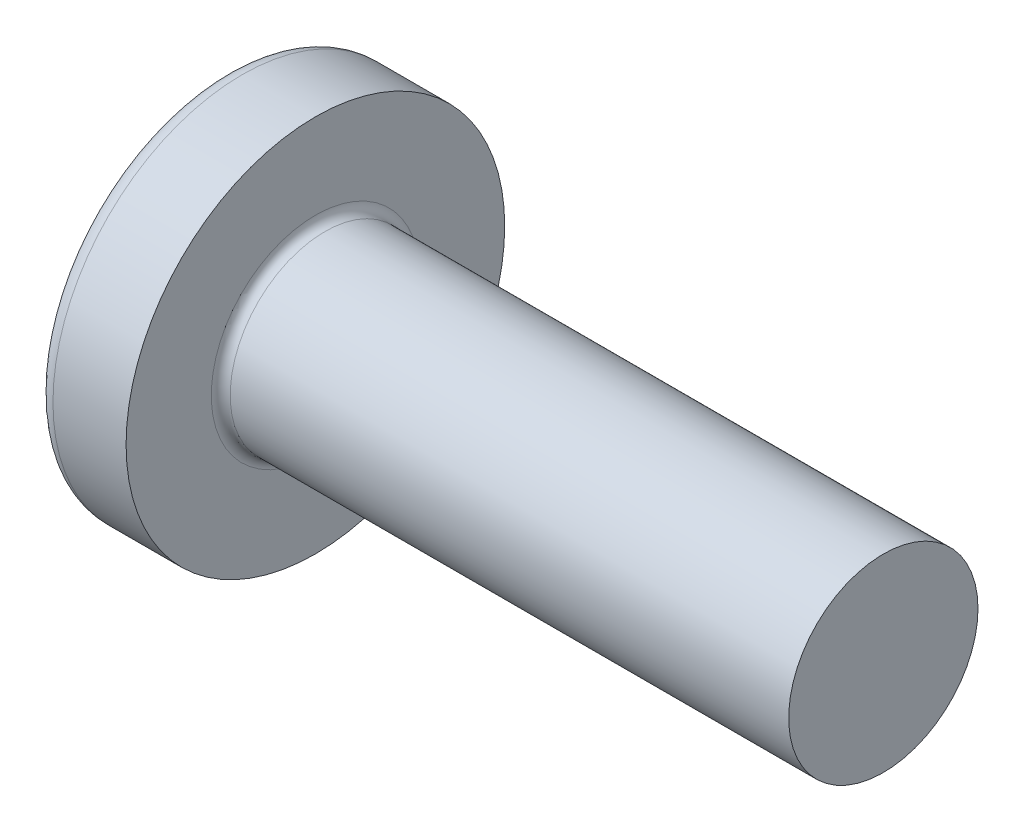
ISO-10303-21;
HEADER;
FILE_DESCRIPTION(('STEP AP214'),'2;1');
FILE_NAME('part.step','',(''),(''),'','','');
FILE_SCHEMA(('AUTOMOTIVE_DESIGN { 1 0 10303 214 1 1 1 1 }'));
ENDSEC;
DATA;
#1=APPLICATION_CONTEXT('core data for automotive mechanical design processes');
#2=APPLICATION_PROTOCOL_DEFINITION('international standard','automotive_design',2000,#1);
#3=PRODUCT_CONTEXT('',#1,'mechanical');
#4=PRODUCT('Part','Part','',(#3));
#5=PRODUCT_RELATED_PRODUCT_CATEGORY('part','',(#4));
#6=PRODUCT_DEFINITION_FORMATION('','',#4);
#7=PRODUCT_DEFINITION_CONTEXT('part definition',#1,'design');
#8=PRODUCT_DEFINITION('design','',#6,#7);
#9=PRODUCT_DEFINITION_SHAPE('','',#8);
#10=(LENGTH_UNIT() NAMED_UNIT(*) SI_UNIT(.MILLI.,.METRE.));
#11=(NAMED_UNIT(*) PLANE_ANGLE_UNIT() SI_UNIT($,.RADIAN.));
#12=(NAMED_UNIT(*) SI_UNIT($,.STERADIAN.) SOLID_ANGLE_UNIT());
#13=UNCERTAINTY_MEASURE_WITH_UNIT(LENGTH_MEASURE(1.E-05),#10,'distance_accuracy_value','');
#14=(GEOMETRIC_REPRESENTATION_CONTEXT(3) GLOBAL_UNCERTAINTY_ASSIGNED_CONTEXT((#13)) GLOBAL_UNIT_ASSIGNED_CONTEXT((#10,
#11,#12)) REPRESENTATION_CONTEXT('',''));
#15=CARTESIAN_POINT('',(0.,0.,0.));
#16=DIRECTION('',(0.,0.,1.));
#17=DIRECTION('',(1.,0.,0.));
#18=AXIS2_PLACEMENT_3D('',#15,#16,#17);
#19=CARTESIAN_POINT('',(2.34,0.,0.));
#20=DIRECTION('',(-1.,0.,0.));
#21=DIRECTION('',(0.,0.,1.));
#22=AXIS2_PLACEMENT_3D('',#19,#20,#21);
#23=PLANE('',#22);
#24=CARTESIAN_POINT('',(2.34,0.,0.));
#25=DIRECTION('',(-1.,0.,0.));
#26=DIRECTION('',(0.,0.,1.));
#27=AXIS2_PLACEMENT_3D('',#24,#25,#26);
#28=CIRCLE('',#27,0.850999999999999);
#29=CARTESIAN_POINT('',(2.34,0.688622538115039,0.5));
#30=VERTEX_POINT('',#29);
#31=CARTESIAN_POINT('',(2.34,0.688622538115039,-0.5));
#32=VERTEX_POINT('',#31);
#33=EDGE_CURVE('E307',#30,#32,#28,.T.);
#34=ORIENTED_EDGE('',*,*,#33,.F.);
#35=DIRECTION('',(0.,-1.,0.));
#36=VECTOR('',#35,1.);
#37=CARTESIAN_POINT('',(2.34,0.985,0.5));
#38=LINE('',#37,#36);
#39=CARTESIAN_POINT('',(2.34,0.985,0.5));
#40=VERTEX_POINT('',#39);
#41=EDGE_CURVE('E189',#40,#30,#38,.T.);
#42=ORIENTED_EDGE('',*,*,#41,.F.);
#43=DIRECTION('',(0.,0.,1.));
#44=VECTOR('',#43,1.);
#45=CARTESIAN_POINT('',(2.34,0.985,-0.5));
#46=LINE('',#45,#44);
#47=CARTESIAN_POINT('',(2.34,0.985,-0.5));
#48=VERTEX_POINT('',#47);
#49=EDGE_CURVE('E359',#48,#40,#46,.T.);
#50=ORIENTED_EDGE('',*,*,#49,.F.);
#51=DIRECTION('',(0.,1.,0.));
#52=VECTOR('',#51,1.);
#53=CARTESIAN_POINT('',(2.34,0.5,-0.5));
#54=LINE('',#53,#52);
#55=EDGE_CURVE('E362',#32,#48,#54,.T.);
#56=ORIENTED_EDGE('',*,*,#55,.F.);
#57=EDGE_LOOP('',(#34,#42,#50,#56));
#58=FACE_BOUND('',#57,.T.);
#59=ADVANCED_FACE('F37',(#58),#23,.T.);
#60=CARTESIAN_POINT('',(2.34,0.5,-0.688622538115039));
#61=VERTEX_POINT('',#60);
#62=CARTESIAN_POINT('',(2.34,-0.5,-0.688622538115039));
#63=VERTEX_POINT('',#62);
#64=EDGE_CURVE('E277',#61,#63,#28,.T.);
#65=ORIENTED_EDGE('',*,*,#64,.F.);
#66=DIRECTION('',(0.,0.,1.));
#67=VECTOR('',#66,1.);
#68=CARTESIAN_POINT('',(2.34,0.5,-0.985));
#69=LINE('',#68,#67);
#70=CARTESIAN_POINT('',(2.34,0.5,-0.985));
#71=VERTEX_POINT('',#70);
#72=EDGE_CURVE('E364',#71,#61,#69,.T.);
#73=ORIENTED_EDGE('',*,*,#72,.F.);
#74=DIRECTION('',(0.,1.,0.));
#75=VECTOR('',#74,1.);
#76=CARTESIAN_POINT('',(2.34,-0.5,-0.985));
#77=LINE('',#76,#75);
#78=CARTESIAN_POINT('',(2.34,-0.5,-0.985));
#79=VERTEX_POINT('',#78);
#80=EDGE_CURVE('E367',#79,#71,#77,.T.);
#81=ORIENTED_EDGE('',*,*,#80,.F.);
#82=DIRECTION('',(0.,0.,-1.));
#83=VECTOR('',#82,1.);
#84=CARTESIAN_POINT('',(2.34,-0.5,-0.5));
#85=LINE('',#84,#83);
#86=EDGE_CURVE('E284',#63,#79,#85,.T.);
#87=ORIENTED_EDGE('',*,*,#86,.F.);
#88=EDGE_LOOP('',(#65,#73,#81,#87));
#89=FACE_BOUND('',#88,.T.);
#90=ADVANCED_FACE('F237',(#89),#23,.T.);
#91=CARTESIAN_POINT('',(2.34,-0.688622538115039,-0.5));
#92=VERTEX_POINT('',#91);
#93=CARTESIAN_POINT('',(2.34,-0.688622538115039,0.5));
#94=VERTEX_POINT('',#93);
#95=EDGE_CURVE('E268',#92,#94,#28,.T.);
#96=ORIENTED_EDGE('',*,*,#95,.F.);
#97=DIRECTION('',(0.,1.,0.));
#98=VECTOR('',#97,1.);
#99=CARTESIAN_POINT('',(2.34,-0.985,-0.5));
#100=LINE('',#99,#98);
#101=CARTESIAN_POINT('',(2.34,-0.985,-0.5));
#102=VERTEX_POINT('',#101);
#103=EDGE_CURVE('E271',#102,#92,#100,.T.);
#104=ORIENTED_EDGE('',*,*,#103,.F.);
#105=DIRECTION('',(0.,0.,-1.));
#106=VECTOR('',#105,1.);
#107=CARTESIAN_POINT('',(2.34,-0.985,0.5));
#108=LINE('',#107,#106);
#109=CARTESIAN_POINT('',(2.34,-0.985,0.5));
#110=VERTEX_POINT('',#109);
#111=EDGE_CURVE('E291',#110,#102,#108,.T.);
#112=ORIENTED_EDGE('',*,*,#111,.F.);
#113=DIRECTION('',(0.,-1.,0.));
#114=VECTOR('',#113,1.);
#115=CARTESIAN_POINT('',(2.34,-0.5,0.5));
#116=LINE('',#115,#114);
#117=EDGE_CURVE('E273',#94,#110,#116,.T.);
#118=ORIENTED_EDGE('',*,*,#117,.F.);
#119=EDGE_LOOP('',(#96,#104,#112,#118));
#120=FACE_BOUND('',#119,.T.);
#121=ADVANCED_FACE('F244',(#120),#23,.T.);
#122=CARTESIAN_POINT('',(3.1,0.,0.));
#123=DIRECTION('',(1.,0.,0.));
#124=DIRECTION('',(0.,0.,-1.));
#125=AXIS2_PLACEMENT_3D('',#122,#123,#124);
#126=PLANE('',#125);
#127=CARTESIAN_POINT('',(3.1,0.,0.));
#128=DIRECTION('',(1.,0.,0.));
#129=DIRECTION('',(0.,0.,-1.));
#130=AXIS2_PLACEMENT_3D('',#127,#128,#129);
#131=CIRCLE('',#130,2.2);
#132=CARTESIAN_POINT('',(3.1,0.,-2.2));
#133=VERTEX_POINT('',#132);
#134=EDGE_CURVE('E339',#133,#133,#131,.F.);
#135=ORIENTED_EDGE('',*,*,#134,.T.);
#136=EDGE_LOOP('',(#135));
#137=FACE_BOUND('',#136,.T.);
#138=CARTESIAN_POINT('',(3.1,0.,0.));
#139=DIRECTION('',(1.,0.,0.));
#140=DIRECTION('',(0.,0.,-1.));
#141=AXIS2_PLACEMENT_3D('',#138,#139,#140);
#142=CIRCLE('',#141,4.);
#143=CARTESIAN_POINT('',(3.1,0.,-4.));
#144=VERTEX_POINT('',#143);
#145=EDGE_CURVE('E350',#144,#144,#142,.T.);
#146=ORIENTED_EDGE('',*,*,#145,.T.);
#147=EDGE_LOOP('',(#146));
#148=FACE_BOUND('',#147,.T.);
#149=ADVANCED_FACE('F258',(#137,#148),#126,.T.);
#150=CARTESIAN_POINT('',(3.1,0.,0.));
#151=DIRECTION('',(-1.,0.,0.));
#152=DIRECTION('',(0.,0.,1.));
#153=AXIS2_PLACEMENT_3D('',#150,#151,#152);
#154=CYLINDRICAL_SURFACE('',#153,4.);
#155=CARTESIAN_POINT('',(1.55530587396955,0.,0.));
#156=DIRECTION('',(1.,0.,0.));
#157=DIRECTION('',(0.,0.,-1.));
#158=AXIS2_PLACEMENT_3D('',#155,#156,#157);
#159=CIRCLE('',#158,4.);
#160=CARTESIAN_POINT('',(1.55530587396955,0.,-4.));
#161=VERTEX_POINT('',#160);
#162=EDGE_CURVE('E46',#161,#161,#159,.T.);
#163=ORIENTED_EDGE('',*,*,#162,.T.);
#164=EDGE_LOOP('',(#163));
#165=FACE_BOUND('',#164,.T.);
#166=ORIENTED_EDGE('',*,*,#145,.F.);
#167=EDGE_LOOP('',(#166));
#168=FACE_BOUND('',#167,.T.);
#169=ADVANCED_FACE('F222',(#165,#168),#154,.T.);
#170=CARTESIAN_POINT('',(6.5,0.,0.));
#171=DIRECTION('',(-1.,0.,0.));
#172=DIRECTION('',(0.,1.,0.));
#173=AXIS2_PLACEMENT_3D('',#170,#171,#172);
#174=SPHERICAL_SURFACE('',#173,6.5);
#175=CARTESIAN_POINT('',(1.26538895452803,0.,0.));
#176=DIRECTION('',(1.,0.,0.));
#177=DIRECTION('',(0.,0.,-1.));
#178=AXIS2_PLACEMENT_3D('',#175,#176,#177);
#179=CIRCLE('',#178,3.85342019543974);
#180=CARTESIAN_POINT('',(1.26538895452803,0.,-3.85342019543974));
#181=VERTEX_POINT('',#180);
#182=EDGE_CURVE('E11',#181,#181,#179,.F.);
#183=ORIENTED_EDGE('',*,*,#182,.T.);
#184=EDGE_LOOP('',(#183));
#185=FACE_BOUND('',#184,.T.);
#186=CARTESIAN_POINT('',(6.5,0.5,0.));
#187=DIRECTION('',(0.,1.,0.));
#188=DIRECTION('',(0.,0.,1.));
#189=AXIS2_PLACEMENT_3D('',#186,#187,#188);
#190=CIRCLE('',#189,6.48074069840786);
#191=CARTESIAN_POINT('',(0.331233322160455,0.5,-1.98653408588337));
#192=VERTEX_POINT('',#191);
#193=CARTESIAN_POINT('',(0.0788099820016224,0.5,-0.876537935720995));
#194=VERTEX_POINT('',#193);
#195=EDGE_CURVE('E352',#192,#194,#190,.T.);
#196=ORIENTED_EDGE('',*,*,#195,.T.);
#197=CARTESIAN_POINT('',(0.0788099820016284,0.,0.));
#198=DIRECTION('',(1.,0.,0.));
#199=DIRECTION('',(0.,0.,-1.));
#200=AXIS2_PLACEMENT_3D('',#197,#198,#199);
#201=CIRCLE('',#200,1.0091178091571);
#202=CARTESIAN_POINT('',(0.0788099820016224,0.876537935720995,-0.5));
#203=VERTEX_POINT('',#202);
#204=EDGE_CURVE('E176',#194,#203,#201,.T.);
#205=ORIENTED_EDGE('',*,*,#204,.T.);
#206=CARTESIAN_POINT('',(6.5,0.,-0.500000000000001));
#207=DIRECTION('',(0.,0.,-1.));
#208=DIRECTION('',(0.,1.,0.));
#209=AXIS2_PLACEMENT_3D('',#206,#207,#208);
#210=CIRCLE('',#209,6.48074069840786);
#211=CARTESIAN_POINT('',(0.331233322160454,1.98653408588337,-0.499999999999998));
#212=VERTEX_POINT('',#211);
#213=EDGE_CURVE('E334',#203,#212,#210,.T.);
#214=ORIENTED_EDGE('',*,*,#213,.T.);
#215=CARTESIAN_POINT('',(6.06510327446345,-0.872267916661894,0.));
#216=DIRECTION('',(-0.446197800778961,-0.894934367749959,0.));
#217=DIRECTION('',(0.894934367749959,-0.446197800778961,0.));
#218=AXIS2_PLACEMENT_3D('',#215,#216,#217);
#219=CIRCLE('',#218,6.42650865709212);
#220=CARTESIAN_POINT('',(0.331233322160455,1.98653408588337,0.5));
#221=VERTEX_POINT('',#220);
#222=EDGE_CURVE('E182',#212,#221,#219,.F.);
#223=ORIENTED_EDGE('',*,*,#222,.T.);
#224=CARTESIAN_POINT('',(6.5,0.,0.5));
#225=DIRECTION('',(0.,0.,1.));
#226=DIRECTION('',(1.,0.,0.));
#227=AXIS2_PLACEMENT_3D('',#224,#225,#226);
#228=CIRCLE('',#227,6.48074069840786);
#229=CARTESIAN_POINT('',(0.0788099820016224,0.876537935720995,0.5));
#230=VERTEX_POINT('',#229);
#231=EDGE_CURVE('E174',#221,#230,#228,.T.);
#232=ORIENTED_EDGE('',*,*,#231,.T.);
#233=CARTESIAN_POINT('',(0.0788099820016224,0.499999999999999,0.876537935720996));
#234=VERTEX_POINT('',#233);
#235=EDGE_CURVE('E164',#230,#234,#201,.T.);
#236=ORIENTED_EDGE('',*,*,#235,.T.);
#237=CARTESIAN_POINT('',(6.5,0.5,0.));
#238=DIRECTION('',(0.,1.,0.));
#239=DIRECTION('',(0.,0.,1.));
#240=AXIS2_PLACEMENT_3D('',#237,#238,#239);
#241=CIRCLE('',#240,6.48074069840786);
#242=CARTESIAN_POINT('',(0.331233322160455,0.499999999999998,1.98653408588337));
#243=VERTEX_POINT('',#242);
#244=EDGE_CURVE('E173',#234,#243,#241,.T.);
#245=ORIENTED_EDGE('',*,*,#244,.T.);
#246=CARTESIAN_POINT('',(6.06510327446345,0.,-0.872267916661894));
#247=DIRECTION('',(-0.446197800778961,0.,-0.894934367749959));
#248=DIRECTION('',(-0.894934367749959,0.,0.446197800778961));
#249=AXIS2_PLACEMENT_3D('',#246,#247,#248);
#250=CIRCLE('',#249,6.42650865709212);
#251=CARTESIAN_POINT('',(0.331233322160455,-0.499999999999998,1.98653408588337));
#252=VERTEX_POINT('',#251);
#253=EDGE_CURVE('E332',#243,#252,#250,.F.);
#254=ORIENTED_EDGE('',*,*,#253,.T.);
#255=CARTESIAN_POINT('',(6.5,-0.5,0.));
#256=DIRECTION('',(0.,-1.,0.));
#257=DIRECTION('',(0.,0.,-1.));
#258=AXIS2_PLACEMENT_3D('',#255,#256,#257);
#259=CIRCLE('',#258,6.48074069840786);
#260=CARTESIAN_POINT('',(0.0788099820016224,-0.499999999999999,0.876537935720996));
#261=VERTEX_POINT('',#260);
#262=EDGE_CURVE('E329',#252,#261,#259,.T.);
#263=ORIENTED_EDGE('',*,*,#262,.T.);
#264=CARTESIAN_POINT('',(0.0788099820016224,-0.876537935720995,0.5));
#265=VERTEX_POINT('',#264);
#266=EDGE_CURVE('E177',#261,#265,#201,.T.);
#267=ORIENTED_EDGE('',*,*,#266,.T.);
#268=CARTESIAN_POINT('',(6.5,0.,0.5));
#269=DIRECTION('',(0.,0.,1.));
#270=DIRECTION('',(1.,0.,0.));
#271=AXIS2_PLACEMENT_3D('',#268,#269,#270);
#272=CIRCLE('',#271,6.48074069840786);
#273=CARTESIAN_POINT('',(0.331233322160454,-1.98653408588337,0.5));
#274=VERTEX_POINT('',#273);
#275=EDGE_CURVE('E327',#265,#274,#272,.T.);
#276=ORIENTED_EDGE('',*,*,#275,.T.);
#277=CARTESIAN_POINT('',(6.06510327446345,0.872267916661894,0.));
#278=DIRECTION('',(-0.446197800778961,0.894934367749959,0.));
#279=DIRECTION('',(-0.894934367749959,-0.446197800778961,0.));
#280=AXIS2_PLACEMENT_3D('',#277,#278,#279);
#281=CIRCLE('',#280,6.42650865709212);
#282=CARTESIAN_POINT('',(0.331233322160455,-1.98653408588337,-0.499999999999998));
#283=VERTEX_POINT('',#282);
#284=EDGE_CURVE('E326',#274,#283,#281,.F.);
#285=ORIENTED_EDGE('',*,*,#284,.T.);
#286=CARTESIAN_POINT('',(6.5,0.,-0.500000000000001));
#287=DIRECTION('',(0.,0.,-1.));
#288=DIRECTION('',(0.,1.,0.));
#289=AXIS2_PLACEMENT_3D('',#286,#287,#288);
#290=CIRCLE('',#289,6.48074069840786);
#291=CARTESIAN_POINT('',(0.0788099820016224,-0.876537935720995,-0.5));
#292=VERTEX_POINT('',#291);
#293=EDGE_CURVE('E324',#283,#292,#290,.T.);
#294=ORIENTED_EDGE('',*,*,#293,.T.);
#295=CARTESIAN_POINT('',(0.0788099820016224,-0.5,-0.876537935720995));
#296=VERTEX_POINT('',#295);
#297=EDGE_CURVE('E157',#292,#296,#201,.T.);
#298=ORIENTED_EDGE('',*,*,#297,.T.);
#299=CARTESIAN_POINT('',(6.5,-0.5,0.));
#300=DIRECTION('',(0.,-1.,0.));
#301=DIRECTION('',(0.,0.,-1.));
#302=AXIS2_PLACEMENT_3D('',#299,#300,#301);
#303=CIRCLE('',#302,6.48074069840786);
#304=CARTESIAN_POINT('',(0.331233322160454,-0.5,-1.98653408588337));
#305=VERTEX_POINT('',#304);
#306=EDGE_CURVE('E321',#296,#305,#303,.T.);
#307=ORIENTED_EDGE('',*,*,#306,.T.);
#308=CARTESIAN_POINT('',(6.06510327446345,0.,0.872267916661894));
#309=DIRECTION('',(-0.446197800778961,0.,0.894934367749959));
#310=DIRECTION('',(0.894934367749959,0.,0.446197800778961));
#311=AXIS2_PLACEMENT_3D('',#308,#309,#310);
#312=CIRCLE('',#311,6.42650865709212);
#313=EDGE_CURVE('E323',#305,#192,#312,.F.);
#314=ORIENTED_EDGE('',*,*,#313,.T.);
#315=EDGE_LOOP('',(#196,#205,#214,#223,#232,#236,#245,#254,#263,#267,#276,#285,#294,#298,#307,#314));
#316=FACE_BOUND('',#315,.T.);
#317=ADVANCED_FACE('F180',(#185,#316),#174,.T.);
#318=CARTESIAN_POINT('',(15.1,0.,0.));
#319=DIRECTION('',(-1.,0.,0.));
#320=DIRECTION('',(0.,0.,1.));
#321=AXIS2_PLACEMENT_3D('',#318,#319,#320);
#322=CYLINDRICAL_SURFACE('',#321,2.);
#323=CARTESIAN_POINT('',(3.3,0.,0.));
#324=DIRECTION('',(1.,0.,0.));
#325=DIRECTION('',(0.,0.,-1.));
#326=AXIS2_PLACEMENT_3D('',#323,#324,#325);
#327=CIRCLE('',#326,2.);
#328=CARTESIAN_POINT('',(3.3,0.,-2.));
#329=VERTEX_POINT('',#328);
#330=EDGE_CURVE('E336',#329,#329,#327,.T.);
#331=ORIENTED_EDGE('',*,*,#330,.T.);
#332=EDGE_LOOP('',(#331));
#333=FACE_BOUND('',#332,.T.);
#334=CARTESIAN_POINT('',(15.1,0.,0.));
#335=DIRECTION('',(1.,0.,0.));
#336=DIRECTION('',(0.,0.,-1.));
#337=AXIS2_PLACEMENT_3D('',#334,#335,#336);
#338=CIRCLE('',#337,2.);
#339=CARTESIAN_POINT('',(15.1,0.,-2.));
#340=VERTEX_POINT('',#339);
#341=EDGE_CURVE('E194',#340,#340,#338,.T.);
#342=ORIENTED_EDGE('',*,*,#341,.F.);
#343=EDGE_LOOP('',(#342));
#344=FACE_BOUND('',#343,.T.);
#345=ADVANCED_FACE('F221',(#333,#344),#322,.T.);
#346=CARTESIAN_POINT('',(15.1,0.,0.));
#347=DIRECTION('',(1.,0.,0.));
#348=DIRECTION('',(0.,0.,-1.));
#349=AXIS2_PLACEMENT_3D('',#346,#347,#348);
#350=PLANE('',#349);
#351=ORIENTED_EDGE('',*,*,#341,.T.);
#352=EDGE_LOOP('',(#351));
#353=FACE_BOUND('',#352,.T.);
#354=ADVANCED_FACE('F216',(#353),#350,.T.);
#355=CARTESIAN_POINT('',(0.,0.985,0.5));
#356=DIRECTION('',(0.,0.,1.));
#357=DIRECTION('',(1.,0.,0.));
#358=AXIS2_PLACEMENT_3D('',#355,#356,#357);
#359=PLANE('',#358);
#360=ORIENTED_EDGE('',*,*,#41,.T.);
#361=CARTESIAN_POINT('',(-1.47307208551745,0.999554986898779,0.5));
#362=CARTESIAN_POINT('',(-1.16591378316868,0.975533086609772,0.5));
#363=CARTESIAN_POINT('',(-0.858767916661878,0.951350295063964,0.5));
#364=CARTESIAN_POINT('',(-0.244502482885165,0.902549597483037,0.5));
#365=CARTESIAN_POINT('',(0.0626170834576021,0.877931679786742,0.5));
#366=CARTESIAN_POINT('',(0.676811647000695,0.828148703943227,0.5));
#367=CARTESIAN_POINT('',(0.983886644251829,0.802983646424752,0.5));
#368=CARTESIAN_POINT('',(1.44444981342565,0.764692431347782,0.5));
#369=CARTESIAN_POINT('',(1.59796058421054,0.751838264741807,0.5));
#370=CARTESIAN_POINT('',(1.90496588417429,0.72591631942006,0.5));
#371=CARTESIAN_POINT('',(2.05846041313682,0.712848538149959,0.5));
#372=CARTESIAN_POINT('',(2.57295428363768,0.668633618373419,0.5));
#373=CARTESIAN_POINT('',(2.9339066135914,0.636931522584992,0.5));
#374=CARTESIAN_POINT('',(3.47518197182085,0.587796838341151,0.5));
#375=CARTESIAN_POINT('',(3.65557679569325,0.57115548156637,0.5));
#376=CARTESIAN_POINT('',(4.0163046373727,0.537182838859119,0.5));
#377=CARTESIAN_POINT('',(4.19663765416812,0.519851542131541,0.5));
#378=CARTESIAN_POINT('',(4.55725439383954,0.484262643923958,0.5));
#379=CARTESIAN_POINT('',(4.73753809586072,0.46600483046619,0.5));
#380=CARTESIAN_POINT('',(5.09796422290529,0.428199403558746,0.5));
#381=CARTESIAN_POINT('',(5.27810665366959,0.408651845597415,0.5));
#382=CARTESIAN_POINT('',(5.5481726571651,0.377850737655578,0.5));
#383=CARTESIAN_POINT('',(5.6381802043131,0.367335802520884,0.5));
#384=CARTESIAN_POINT('',(5.81811589957681,0.345661558095862,0.5));
#385=CARTESIAN_POINT('',(5.90804404933485,0.334502262466876,0.5));
#386=CARTESIAN_POINT('',(6.08780716935509,0.311341139224618,0.5));
#387=CARTESIAN_POINT('',(6.1776421238159,0.299339186873565,0.5));
#388=CARTESIAN_POINT('',(6.35714113259883,0.274080047202727,0.5));
#389=CARTESIAN_POINT('',(6.44680517388271,0.260822767744076,0.5));
#390=CARTESIAN_POINT('',(6.53634497352463,0.24673157516509,0.5));
#391=B_SPLINE_CURVE_WITH_KNOTS('',3,(#361,#362,#363,#364,#365,#366,#367,#368,#369,#370,#371,
#372,#373,#374,#375,#376,#377,#378,#379,#380,#381,#382,#383,#384,#385,#386,#387,#388,#389,#390),
.UNSPECIFIED.,.F.,.F.,(4,2,2,2,2,2,2,2,2,2,2,2,2,2,4),(0.,0.924288798488501,1.84860240515113,
2.77291494969619,3.23505878985799,3.6972081602195,4.78422857823856,5.32771001773297,
5.87119996412535,6.41481482117433,6.95840630565317,7.23026343761201,7.50211480793502,
7.77400650538476,8.04591817471286),.UNSPECIFIED.);
#392=EDGE_CURVE('E168',#30,#230,#391,.F.);
#393=ORIENTED_EDGE('',*,*,#392,.T.);
#394=ORIENTED_EDGE('',*,*,#231,.F.);
#395=DIRECTION('',(-0.894934367749959,0.446197800778961,0.));
#396=VECTOR('',#395,1.);
#397=CARTESIAN_POINT('',(2.34,0.985,0.5));
#398=LINE('',#397,#396);
#399=EDGE_CURVE('E190',#221,#40,#398,.F.);
#400=ORIENTED_EDGE('',*,*,#399,.T.);
#401=EDGE_LOOP('',(#360,#393,#394,#400));
#402=FACE_BOUND('',#401,.T.);
#403=ADVANCED_FACE('F187',(#402),#359,.F.);
#404=CARTESIAN_POINT('',(2.34,0.985,-0.5));
#405=DIRECTION('',(-0.446197800778961,-0.894934367749959,0.));
#406=DIRECTION('',(0.894934367749959,-0.446197800778961,0.));
#407=AXIS2_PLACEMENT_3D('',#404,#405,#406);
#408=PLANE('',#407);
#409=DIRECTION('',(-0.894934367749959,0.446197800778961,0.));
#410=VECTOR('',#409,1.);
#411=CARTESIAN_POINT('',(0.659545504327553,1.82284367580312,-0.499999999999999));
#412=LINE('',#411,#410);
#413=EDGE_CURVE('E192',#212,#48,#412,.F.);
#414=ORIENTED_EDGE('',*,*,#413,.T.);
#415=ORIENTED_EDGE('',*,*,#49,.T.);
#416=ORIENTED_EDGE('',*,*,#399,.F.);
#417=ORIENTED_EDGE('',*,*,#222,.F.);
#418=EDGE_LOOP('',(#414,#415,#416,#417));
#419=FACE_BOUND('',#418,.T.);
#420=ADVANCED_FACE('F215',(#419),#408,.T.);
#421=CARTESIAN_POINT('',(0.,0.5,-0.5));
#422=DIRECTION('',(0.,0.,-1.));
#423=DIRECTION('',(0.,1.,0.));
#424=AXIS2_PLACEMENT_3D('',#421,#422,#423);
#425=PLANE('',#424);
#426=ORIENTED_EDGE('',*,*,#213,.F.);
#427=CARTESIAN_POINT('',(-1.47307208726352,0.999554987035301,-0.5));
#428=CARTESIAN_POINT('',(-1.1659137847032,0.975533086730397,-0.5));
#429=CARTESIAN_POINT('',(-0.858767917984853,0.951350295168549,-0.5));
#430=CARTESIAN_POINT('',(-0.244502483785055,0.902549597555061,-0.5));
#431=CARTESIAN_POINT('',(0.0626170827692527,0.877931679842246,-0.5));
#432=CARTESIAN_POINT('',(0.676811646903488,0.828148703951396,-0.5));
#433=CARTESIAN_POINT('',(0.9838866445342,0.802983646401807,-0.5));
#434=CARTESIAN_POINT('',(1.44444981427725,0.764692431276716,-0.5));
#435=CARTESIAN_POINT('',(1.59796058525185,0.751838264654461,-0.5));
#436=CARTESIAN_POINT('',(1.90496588559497,0.725916319299535,-0.5));
#437=CARTESIAN_POINT('',(2.05846041474715,0.712848538012537,-0.5));
#438=CARTESIAN_POINT('',(2.57295428543761,0.668633618216407,-0.5));
#439=CARTESIAN_POINT('',(2.93390661539127,0.636931522425228,-0.5));
#440=CARTESIAN_POINT('',(3.47518197362044,0.587796838176005,-0.5));
#441=CARTESIAN_POINT('',(3.65557679749271,0.571155481399222,-0.5));
#442=CARTESIAN_POINT('',(4.01630463917184,0.537182838687343,-0.5));
#443=CARTESIAN_POINT('',(4.19663765596707,0.519851541957137,-0.5));
#444=CARTESIAN_POINT('',(4.55725439563813,0.484262643743324,-0.5));
#445=CARTESIAN_POINT('',(4.73753809765912,0.466004830281953,-0.500000000000001));
#446=CARTESIAN_POINT('',(5.09796422470311,0.428199403365721,-0.500000000000001));
#447=CARTESIAN_POINT('',(5.27810665546701,0.408651845399205,-0.5));
#448=CARTESIAN_POINT('',(5.54817265896168,0.377850737447313,-0.500000000000001));
#449=CARTESIAN_POINT('',(5.63818020610939,0.367335802308882,-0.500000000000001));
#450=CARTESIAN_POINT('',(5.81811590137235,0.345661557875224,-0.500000000000001));
#451=CARTESIAN_POINT('',(5.90804405112992,0.334502262241339,-0.500000000000001));
#452=CARTESIAN_POINT('',(6.08780717114903,0.311341138987565,-0.500000000000001));
#453=CARTESIAN_POINT('',(6.17764212560917,0.299339186629895,-0.500000000000001));
#454=CARTESIAN_POINT('',(6.3571411343902,0.27408004694249,-0.500000000000001));
#455=CARTESIAN_POINT('',(6.44680517567285,0.260822767473888,-0.500000000000001));
#456=CARTESIAN_POINT('',(6.53634497531308,0.246731574882477,-0.500000000000001));
#457=B_SPLINE_CURVE_WITH_KNOTS('',3,(#427,#428,#429,#430,#431,#432,#433,#434,#435,#436,#437,
#438,#439,#440,#441,#442,#443,#444,#445,#446,#447,#448,#449,#450,#451,#452,#453,#454,#455,#456),
.UNSPECIFIED.,.F.,.F.,(4,2,2,2,2,2,2,2,2,2,2,2,2,2,4),(0.,0.924288799124948,1.84860240642413,
2.77291495211174,3.23505879284475,3.6972081637775,4.78422858179707,5.32771002129163,
5.87119996768419,6.41481482473372,6.95840630921301,7.2302634411723,7.50211481149573,
7.77400650894606,8.04591817827486),.UNSPECIFIED.);
#458=EDGE_CURVE('E54',#203,#32,#457,.T.);
#459=ORIENTED_EDGE('',*,*,#458,.T.);
#460=ORIENTED_EDGE('',*,*,#55,.T.);
#461=ORIENTED_EDGE('',*,*,#413,.F.);
#462=EDGE_LOOP('',(#426,#459,#460,#461));
#463=FACE_BOUND('',#462,.T.);
#464=ADVANCED_FACE('F405',(#463),#425,.F.);
#465=CARTESIAN_POINT('',(0.,0.5,-0.985));
#466=DIRECTION('',(0.,1.,0.));
#467=DIRECTION('',(0.,0.,1.));
#468=AXIS2_PLACEMENT_3D('',#465,#466,#467);
#469=PLANE('',#468);
#470=ORIENTED_EDGE('',*,*,#72,.T.);
#471=CARTESIAN_POINT('',(-1.47307208551745,0.5,-0.999554986898779));
#472=CARTESIAN_POINT('',(-1.16591378316868,0.5,-0.975533086609773));
#473=CARTESIAN_POINT('',(-0.858767916661879,0.5,-0.951350295063965));
#474=CARTESIAN_POINT('',(-0.244502482885165,0.5,-0.902549597483037));
#475=CARTESIAN_POINT('',(0.0626170834576018,0.5,-0.877931679786742));
#476=CARTESIAN_POINT('',(0.676811647000695,0.5,-0.828148703943228));
#477=CARTESIAN_POINT('',(0.983886644251829,0.5,-0.802983646424753));
#478=CARTESIAN_POINT('',(1.44444981342565,0.5,-0.764692431347783));
#479=CARTESIAN_POINT('',(1.59796058421054,0.5,-0.751838264741808));
#480=CARTESIAN_POINT('',(1.90496588417429,0.5,-0.72591631942006));
#481=CARTESIAN_POINT('',(2.05846041313682,0.5,-0.712848538149959));
#482=CARTESIAN_POINT('',(2.57295428363767,0.5,-0.668633618373419));
#483=CARTESIAN_POINT('',(2.9339066135914,0.5,-0.636931522584992));
#484=CARTESIAN_POINT('',(3.47518197182084,0.5,-0.587796838341152));
#485=CARTESIAN_POINT('',(3.65557679569325,0.5,-0.571155481566371));
#486=CARTESIAN_POINT('',(4.01630463737269,0.5,-0.53718283885912));
#487=CARTESIAN_POINT('',(4.19663765416811,0.5,-0.519851542131542));
#488=CARTESIAN_POINT('',(4.55725439383954,0.5,-0.484262643923958));
#489=CARTESIAN_POINT('',(4.73753809586071,0.5,-0.46600483046619));
#490=CARTESIAN_POINT('',(5.09796422290529,0.5,-0.428199403558747));
#491=CARTESIAN_POINT('',(5.27810665366958,0.5,-0.408651845597416));
#492=CARTESIAN_POINT('',(5.5481726571651,0.5,-0.377850737655579));
#493=CARTESIAN_POINT('',(5.63818020431309,0.5,-0.367335802520885));
#494=CARTESIAN_POINT('',(5.8181158995768,0.5,-0.345661558095863));
#495=CARTESIAN_POINT('',(5.90804404933484,0.5,-0.334502262466877));
#496=CARTESIAN_POINT('',(6.08780716935509,0.5,-0.311341139224619));
#497=CARTESIAN_POINT('',(6.1776421238159,0.5,-0.299339186873565));
#498=CARTESIAN_POINT('',(6.35714113259883,0.5,-0.274080047202727));
#499=CARTESIAN_POINT('',(6.44680517388271,0.5,-0.260822767744076));
#500=CARTESIAN_POINT('',(6.53634497352462,0.5,-0.246731575165091));
#501=B_SPLINE_CURVE_WITH_KNOTS('',3,(#471,#472,#473,#474,#475,#476,#477,#478,#479,#480,#481,
#482,#483,#484,#485,#486,#487,#488,#489,#490,#491,#492,#493,#494,#495,#496,#497,#498,#499,#500),
.UNSPECIFIED.,.F.,.F.,(4,2,2,2,2,2,2,2,2,2,2,2,2,2,4),(0.,0.9242887984885,1.84860240515113,
2.77291494969619,3.23505878985799,3.6972081602195,4.78422857823856,5.32771001773297,
5.87119996412535,6.41481482117432,6.95840630565317,7.230263437612,7.50211480793502,
7.77400650538475,8.04591817471286),.UNSPECIFIED.);
#502=EDGE_CURVE('E366',#61,#194,#501,.F.);
#503=ORIENTED_EDGE('',*,*,#502,.T.);
#504=ORIENTED_EDGE('',*,*,#195,.F.);
#505=DIRECTION('',(-0.894934367749959,0.,-0.446197800778961));
#506=VECTOR('',#505,1.);
#507=CARTESIAN_POINT('',(2.34,0.5,-0.985));
#508=LINE('',#507,#506);
#509=EDGE_CURVE('E376',#192,#71,#508,.F.);
#510=ORIENTED_EDGE('',*,*,#509,.T.);
#511=EDGE_LOOP('',(#470,#503,#504,#510));
#512=FACE_BOUND('',#511,.T.);
#513=ADVANCED_FACE('F419',(#512),#469,.F.);
#514=CARTESIAN_POINT('',(2.34,-0.5,-0.985));
#515=DIRECTION('',(-0.446197800778961,0.,0.894934367749959));
#516=DIRECTION('',(0.894934367749959,0.,0.446197800778961));
#517=AXIS2_PLACEMENT_3D('',#514,#515,#516);
#518=PLANE('',#517);
#519=DIRECTION('',(-0.894934367749959,0.,-0.446197800778961));
#520=VECTOR('',#519,1.);
#521=CARTESIAN_POINT('',(0.659545504327553,-0.5,-1.82284367580312));
#522=LINE('',#521,#520);
#523=EDGE_CURVE('E369',#305,#79,#522,.F.);
#524=ORIENTED_EDGE('',*,*,#523,.T.);
#525=ORIENTED_EDGE('',*,*,#80,.T.);
#526=ORIENTED_EDGE('',*,*,#509,.F.);
#527=ORIENTED_EDGE('',*,*,#313,.F.);
#528=EDGE_LOOP('',(#524,#525,#526,#527));
#529=FACE_BOUND('',#528,.T.);
#530=ADVANCED_FACE('F420',(#529),#518,.T.);
#531=CARTESIAN_POINT('',(0.,-0.5,-0.5));
#532=DIRECTION('',(0.,-1.,0.));
#533=DIRECTION('',(0.,0.,-1.));
#534=AXIS2_PLACEMENT_3D('',#531,#532,#533);
#535=PLANE('',#534);
#536=ORIENTED_EDGE('',*,*,#306,.F.);
#537=CARTESIAN_POINT('',(-1.47307208551745,-0.5,-0.999554986898779));
#538=CARTESIAN_POINT('',(-1.16591378316868,-0.5,-0.975533086609773));
#539=CARTESIAN_POINT('',(-0.858767916661879,-0.5,-0.951350295063965));
#540=CARTESIAN_POINT('',(-0.244502482885165,-0.5,-0.902549597483037));
#541=CARTESIAN_POINT('',(0.0626170834576018,-0.5,-0.877931679786742));
#542=CARTESIAN_POINT('',(0.676811647000695,-0.5,-0.828148703943228));
#543=CARTESIAN_POINT('',(0.983886644251829,-0.5,-0.802983646424753));
#544=CARTESIAN_POINT('',(1.44444981342565,-0.5,-0.764692431347783));
#545=CARTESIAN_POINT('',(1.59796058421054,-0.5,-0.751838264741808));
#546=CARTESIAN_POINT('',(1.90496588417429,-0.5,-0.72591631942006));
#547=CARTESIAN_POINT('',(2.05846041313682,-0.5,-0.712848538149959));
#548=CARTESIAN_POINT('',(2.57295428363767,-0.5,-0.668633618373419));
#549=CARTESIAN_POINT('',(2.9339066135914,-0.5,-0.636931522584992));
#550=CARTESIAN_POINT('',(3.47518197182084,-0.5,-0.587796838341152));
#551=CARTESIAN_POINT('',(3.65557679569325,-0.5,-0.571155481566371));
#552=CARTESIAN_POINT('',(4.01630463737269,-0.5,-0.53718283885912));
#553=CARTESIAN_POINT('',(4.19663765416811,-0.5,-0.519851542131542));
#554=CARTESIAN_POINT('',(4.55725439383954,-0.5,-0.484262643923958));
#555=CARTESIAN_POINT('',(4.73753809586071,-0.5,-0.46600483046619));
#556=CARTESIAN_POINT('',(5.09796422290529,-0.5,-0.428199403558747));
#557=CARTESIAN_POINT('',(5.27810665366958,-0.5,-0.408651845597416));
#558=CARTESIAN_POINT('',(5.5481726571651,-0.5,-0.377850737655579));
#559=CARTESIAN_POINT('',(5.63818020431309,-0.5,-0.367335802520885));
#560=CARTESIAN_POINT('',(5.8181158995768,-0.5,-0.345661558095863));
#561=CARTESIAN_POINT('',(5.90804404933484,-0.5,-0.334502262466877));
#562=CARTESIAN_POINT('',(6.08780716935509,-0.5,-0.311341139224619));
#563=CARTESIAN_POINT('',(6.1776421238159,-0.5,-0.299339186873565));
#564=CARTESIAN_POINT('',(6.35714113259883,-0.5,-0.274080047202727));
#565=CARTESIAN_POINT('',(6.44680517388271,-0.5,-0.260822767744076));
#566=CARTESIAN_POINT('',(6.53634497352462,-0.5,-0.246731575165091));
#567=B_SPLINE_CURVE_WITH_KNOTS('',3,(#537,#538,#539,#540,#541,#542,#543,#544,#545,#546,#547,
#548,#549,#550,#551,#552,#553,#554,#555,#556,#557,#558,#559,#560,#561,#562,#563,#564,#565,#566),
.UNSPECIFIED.,.F.,.F.,(4,2,2,2,2,2,2,2,2,2,2,2,2,2,4),(0.,0.9242887984885,1.84860240515113,
2.77291494969619,3.23505878985799,3.6972081602195,4.78422857823856,5.32771001773297,
5.87119996412535,6.41481482117432,6.95840630565317,7.230263437612,7.50211480793502,
7.77400650538475,8.04591817471286),.UNSPECIFIED.);
#568=EDGE_CURVE('E287',#296,#63,#567,.T.);
#569=ORIENTED_EDGE('',*,*,#568,.T.);
#570=ORIENTED_EDGE('',*,*,#86,.T.);
#571=ORIENTED_EDGE('',*,*,#523,.F.);
#572=EDGE_LOOP('',(#536,#569,#570,#571));
#573=FACE_BOUND('',#572,.T.);
#574=ADVANCED_FACE('F416',(#573),#535,.F.);
#575=CARTESIAN_POINT('',(0.,-0.985,-0.5));
#576=DIRECTION('',(0.,0.,-1.));
#577=DIRECTION('',(0.,1.,0.));
#578=AXIS2_PLACEMENT_3D('',#575,#576,#577);
#579=PLANE('',#578);
#580=ORIENTED_EDGE('',*,*,#103,.T.);
#581=CARTESIAN_POINT('',(-1.47307208726352,-0.999554987035301,-0.5));
#582=CARTESIAN_POINT('',(-1.1659137847032,-0.975533086730397,-0.5));
#583=CARTESIAN_POINT('',(-0.858767917984853,-0.951350295168549,-0.5));
#584=CARTESIAN_POINT('',(-0.244502483785055,-0.902549597555061,-0.5));
#585=CARTESIAN_POINT('',(0.0626170827692527,-0.877931679842246,-0.5));
#586=CARTESIAN_POINT('',(0.676811646903488,-0.828148703951396,-0.5));
#587=CARTESIAN_POINT('',(0.9838866445342,-0.802983646401807,-0.5));
#588=CARTESIAN_POINT('',(1.44444981427725,-0.764692431276716,-0.5));
#589=CARTESIAN_POINT('',(1.59796058525185,-0.751838264654461,-0.5));
#590=CARTESIAN_POINT('',(1.90496588559497,-0.725916319299535,-0.5));
#591=CARTESIAN_POINT('',(2.05846041474715,-0.712848538012537,-0.5));
#592=CARTESIAN_POINT('',(2.57295428543761,-0.668633618216407,-0.5));
#593=CARTESIAN_POINT('',(2.93390661539127,-0.636931522425228,-0.5));
#594=CARTESIAN_POINT('',(3.47518197362044,-0.587796838176005,-0.5));
#595=CARTESIAN_POINT('',(3.65557679749271,-0.571155481399222,-0.5));
#596=CARTESIAN_POINT('',(4.01630463917184,-0.537182838687343,-0.5));
#597=CARTESIAN_POINT('',(4.19663765596707,-0.519851541957137,-0.5));
#598=CARTESIAN_POINT('',(4.55725439563813,-0.484262643743324,-0.5));
#599=CARTESIAN_POINT('',(4.73753809765912,-0.466004830281953,-0.500000000000001));
#600=CARTESIAN_POINT('',(5.09796422470311,-0.428199403365721,-0.500000000000001));
#601=CARTESIAN_POINT('',(5.27810665546701,-0.408651845399205,-0.5));
#602=CARTESIAN_POINT('',(5.54817265896168,-0.377850737447313,-0.500000000000001));
#603=CARTESIAN_POINT('',(5.63818020610939,-0.367335802308882,-0.500000000000001));
#604=CARTESIAN_POINT('',(5.81811590137235,-0.345661557875224,-0.500000000000001));
#605=CARTESIAN_POINT('',(5.90804405112992,-0.334502262241339,-0.500000000000001));
#606=CARTESIAN_POINT('',(6.08780717114903,-0.311341138987565,-0.500000000000001));
#607=CARTESIAN_POINT('',(6.17764212560917,-0.299339186629895,-0.500000000000001));
#608=CARTESIAN_POINT('',(6.3571411343902,-0.27408004694249,-0.500000000000001));
#609=CARTESIAN_POINT('',(6.44680517567285,-0.260822767473888,-0.500000000000001));
#610=CARTESIAN_POINT('',(6.53634497531308,-0.246731574882477,-0.500000000000001));
#611=B_SPLINE_CURVE_WITH_KNOTS('',3,(#581,#582,#583,#584,#585,#586,#587,#588,#589,#590,#591,
#592,#593,#594,#595,#596,#597,#598,#599,#600,#601,#602,#603,#604,#605,#606,#607,#608,#609,#610),
.UNSPECIFIED.,.F.,.F.,(4,2,2,2,2,2,2,2,2,2,2,2,2,2,4),(0.,0.924288799124948,1.84860240642413,
2.77291495211174,3.23505879284475,3.6972081637775,4.78422858179707,5.32771002129163,
5.87119996768419,6.41481482473372,6.95840630921301,7.2302634411723,7.50211481149573,
7.77400650894606,8.04591817827486),.UNSPECIFIED.);
#612=EDGE_CURVE('E281',#92,#292,#611,.F.);
#613=ORIENTED_EDGE('',*,*,#612,.T.);
#614=ORIENTED_EDGE('',*,*,#293,.F.);
#615=DIRECTION('',(-0.894934367749959,-0.446197800778961,0.));
#616=VECTOR('',#615,1.);
#617=CARTESIAN_POINT('',(2.34,-0.985,-0.5));
#618=LINE('',#617,#616);
#619=EDGE_CURVE('E283',#283,#102,#618,.F.);
#620=ORIENTED_EDGE('',*,*,#619,.T.);
#621=EDGE_LOOP('',(#580,#613,#614,#620));
#622=FACE_BOUND('',#621,.T.);
#623=ADVANCED_FACE('F280',(#622),#579,.F.);
#624=CARTESIAN_POINT('',(2.34,-0.985,0.5));
#625=DIRECTION('',(-0.446197800778961,0.894934367749959,0.));
#626=DIRECTION('',(-0.894934367749959,-0.446197800778961,0.));
#627=AXIS2_PLACEMENT_3D('',#624,#625,#626);
#628=PLANE('',#627);
#629=DIRECTION('',(-0.894934367749959,-0.446197800778961,0.));
#630=VECTOR('',#629,1.);
#631=CARTESIAN_POINT('',(0.659545504327554,-1.82284367580312,0.5));
#632=LINE('',#631,#630);
#633=EDGE_CURVE('E293',#274,#110,#632,.F.);
#634=ORIENTED_EDGE('',*,*,#633,.T.);
#635=ORIENTED_EDGE('',*,*,#111,.T.);
#636=ORIENTED_EDGE('',*,*,#619,.F.);
#637=ORIENTED_EDGE('',*,*,#284,.F.);
#638=EDGE_LOOP('',(#634,#635,#636,#637));
#639=FACE_BOUND('',#638,.T.);
#640=ADVANCED_FACE('F431',(#639),#628,.T.);
#641=CARTESIAN_POINT('',(0.,-0.5,0.5));
#642=DIRECTION('',(0.,0.,1.));
#643=DIRECTION('',(1.,0.,0.));
#644=AXIS2_PLACEMENT_3D('',#641,#642,#643);
#645=PLANE('',#644);
#646=ORIENTED_EDGE('',*,*,#275,.F.);
#647=CARTESIAN_POINT('',(-1.47307208551745,-0.999554986898779,0.5));
#648=CARTESIAN_POINT('',(-1.16591378316868,-0.975533086609772,0.5));
#649=CARTESIAN_POINT('',(-0.858767916661878,-0.951350295063964,0.5));
#650=CARTESIAN_POINT('',(-0.244502482885165,-0.902549597483037,0.5));
#651=CARTESIAN_POINT('',(0.0626170834576021,-0.877931679786742,0.5));
#652=CARTESIAN_POINT('',(0.676811647000695,-0.828148703943227,0.5));
#653=CARTESIAN_POINT('',(0.983886644251829,-0.802983646424752,0.5));
#654=CARTESIAN_POINT('',(1.44444981342565,-0.764692431347782,0.5));
#655=CARTESIAN_POINT('',(1.59796058421054,-0.751838264741807,0.5));
#656=CARTESIAN_POINT('',(1.90496588417429,-0.72591631942006,0.5));
#657=CARTESIAN_POINT('',(2.05846041313682,-0.712848538149959,0.5));
#658=CARTESIAN_POINT('',(2.57295428363768,-0.668633618373419,0.5));
#659=CARTESIAN_POINT('',(2.9339066135914,-0.636931522584992,0.5));
#660=CARTESIAN_POINT('',(3.47518197182085,-0.587796838341151,0.5));
#661=CARTESIAN_POINT('',(3.65557679569325,-0.57115548156637,0.5));
#662=CARTESIAN_POINT('',(4.0163046373727,-0.537182838859119,0.5));
#663=CARTESIAN_POINT('',(4.19663765416812,-0.519851542131541,0.5));
#664=CARTESIAN_POINT('',(4.55725439383954,-0.484262643923958,0.5));
#665=CARTESIAN_POINT('',(4.73753809586072,-0.46600483046619,0.5));
#666=CARTESIAN_POINT('',(5.09796422290529,-0.428199403558746,0.5));
#667=CARTESIAN_POINT('',(5.27810665366959,-0.408651845597415,0.5));
#668=CARTESIAN_POINT('',(5.5481726571651,-0.377850737655578,0.5));
#669=CARTESIAN_POINT('',(5.6381802043131,-0.367335802520884,0.5));
#670=CARTESIAN_POINT('',(5.81811589957681,-0.345661558095862,0.5));
#671=CARTESIAN_POINT('',(5.90804404933485,-0.334502262466876,0.5));
#672=CARTESIAN_POINT('',(6.08780716935509,-0.311341139224618,0.5));
#673=CARTESIAN_POINT('',(6.1776421238159,-0.299339186873565,0.5));
#674=CARTESIAN_POINT('',(6.35714113259883,-0.274080047202727,0.5));
#675=CARTESIAN_POINT('',(6.44680517388271,-0.260822767744076,0.5));
#676=CARTESIAN_POINT('',(6.53634497352463,-0.24673157516509,0.5));
#677=B_SPLINE_CURVE_WITH_KNOTS('',3,(#647,#648,#649,#650,#651,#652,#653,#654,#655,#656,#657,
#658,#659,#660,#661,#662,#663,#664,#665,#666,#667,#668,#669,#670,#671,#672,#673,#674,#675,#676),
.UNSPECIFIED.,.F.,.F.,(4,2,2,2,2,2,2,2,2,2,2,2,2,2,4),(0.,0.924288798488501,1.84860240515113,
2.77291494969619,3.23505878985799,3.6972081602195,4.78422857823856,5.32771001773297,
5.87119996412535,6.41481482117433,6.95840630565317,7.23026343761201,7.50211480793502,
7.77400650538476,8.04591817471286),.UNSPECIFIED.);
#678=EDGE_CURVE('E151',#265,#94,#677,.T.);
#679=ORIENTED_EDGE('',*,*,#678,.T.);
#680=ORIENTED_EDGE('',*,*,#117,.T.);
#681=ORIENTED_EDGE('',*,*,#633,.F.);
#682=EDGE_LOOP('',(#646,#679,#680,#681));
#683=FACE_BOUND('',#682,.T.);
#684=ADVANCED_FACE('F434',(#683),#645,.F.);
#685=CARTESIAN_POINT('',(0.,-0.499999999999999,0.985));
#686=DIRECTION('',(0.,-1.,0.));
#687=DIRECTION('',(0.,0.,-1.));
#688=AXIS2_PLACEMENT_3D('',#685,#686,#687);
#689=PLANE('',#688);
#690=DIRECTION('',(0.,0.,-1.));
#691=VECTOR('',#690,1.);
#692=CARTESIAN_POINT('',(2.34,-0.499999999999999,0.985));
#693=LINE('',#692,#691);
#694=CARTESIAN_POINT('',(2.34,-0.499999999999999,0.985));
#695=VERTEX_POINT('',#694);
#696=CARTESIAN_POINT('',(2.34,-0.5,0.68862253811504));
#697=VERTEX_POINT('',#696);
#698=EDGE_CURVE('E295',#695,#697,#693,.T.);
#699=ORIENTED_EDGE('',*,*,#698,.T.);
#700=CARTESIAN_POINT('',(-1.47307208551745,-0.499999999999999,0.99955498689878));
#701=CARTESIAN_POINT('',(-1.16591378316868,-0.499999999999999,0.975533086609773));
#702=CARTESIAN_POINT('',(-0.858767916661878,-0.499999999999999,0.951350295063965));
#703=CARTESIAN_POINT('',(-0.244502482885165,-0.499999999999999,0.902549597483037));
#704=CARTESIAN_POINT('',(0.062617083457602,-0.499999999999999,0.877931679786742));
#705=CARTESIAN_POINT('',(0.676811647000695,-0.499999999999999,0.828148703943228));
#706=CARTESIAN_POINT('',(0.983886644251829,-0.499999999999999,0.802983646424753));
#707=CARTESIAN_POINT('',(1.44444981342565,-0.5,0.764692431347783));
#708=CARTESIAN_POINT('',(1.59796058421054,-0.5,0.751838264741808));
#709=CARTESIAN_POINT('',(1.90496588417429,-0.5,0.72591631942006));
#710=CARTESIAN_POINT('',(2.05846041313682,-0.5,0.712848538149959));
#711=CARTESIAN_POINT('',(2.57295428363768,-0.5,0.668633618373419));
#712=CARTESIAN_POINT('',(2.9339066135914,-0.5,0.636931522584992));
#713=CARTESIAN_POINT('',(3.47518197182085,-0.5,0.587796838341151));
#714=CARTESIAN_POINT('',(3.65557679569325,-0.5,0.57115548156637));
#715=CARTESIAN_POINT('',(4.0163046373727,-0.5,0.53718283885912));
#716=CARTESIAN_POINT('',(4.19663765416812,-0.5,0.519851542131542));
#717=CARTESIAN_POINT('',(4.55725439383954,-0.5,0.484262643923958));
#718=CARTESIAN_POINT('',(4.73753809586072,-0.5,0.46600483046619));
#719=CARTESIAN_POINT('',(5.09796422290529,-0.5,0.428199403558747));
#720=CARTESIAN_POINT('',(5.27810665366959,-0.5,0.408651845597415));
#721=CARTESIAN_POINT('',(5.5481726571651,-0.5,0.377850737655579));
#722=CARTESIAN_POINT('',(5.6381802043131,-0.5,0.367335802520885));
#723=CARTESIAN_POINT('',(5.81811589957681,-0.5,0.345661558095863));
#724=CARTESIAN_POINT('',(5.90804404933485,-0.5,0.334502262466877));
#725=CARTESIAN_POINT('',(6.08780716935509,-0.5,0.311341139224618));
#726=CARTESIAN_POINT('',(6.1776421238159,-0.5,0.299339186873565));
#727=CARTESIAN_POINT('',(6.35714113259883,-0.5,0.274080047202727));
#728=CARTESIAN_POINT('',(6.44680517388271,-0.5,0.260822767744076));
#729=CARTESIAN_POINT('',(6.53634497352463,-0.5,0.24673157516509));
#730=B_SPLINE_CURVE_WITH_KNOTS('',3,(#700,#701,#702,#703,#704,#705,#706,#707,#708,#709,#710,
#711,#712,#713,#714,#715,#716,#717,#718,#719,#720,#721,#722,#723,#724,#725,#726,#727,#728,#729),
.UNSPECIFIED.,.F.,.F.,(4,2,2,2,2,2,2,2,2,2,2,2,2,2,4),(0.,0.924288798488501,1.84860240515113,
2.77291494969619,3.23505878985799,3.6972081602195,4.78422857823856,5.32771001773297,
5.87119996412535,6.41481482117433,6.95840630565317,7.23026343761201,7.50211480793502,
7.77400650538476,8.04591817471286),.UNSPECIFIED.);
#731=EDGE_CURVE('E298',#697,#261,#730,.F.);
#732=ORIENTED_EDGE('',*,*,#731,.T.);
#733=ORIENTED_EDGE('',*,*,#262,.F.);
#734=DIRECTION('',(-0.894934367749959,0.,0.446197800778961));
#735=VECTOR('',#734,1.);
#736=CARTESIAN_POINT('',(2.34,-0.499999999999999,0.985));
#737=LINE('',#736,#735);
#738=EDGE_CURVE('E386',#252,#695,#737,.F.);
#739=ORIENTED_EDGE('',*,*,#738,.T.);
#740=EDGE_LOOP('',(#699,#732,#733,#739));
#741=FACE_BOUND('',#740,.T.);
#742=ADVANCED_FACE('F396',(#741),#689,.F.);
#743=CARTESIAN_POINT('',(2.34,0.499999999999999,0.985));
#744=DIRECTION('',(-0.446197800778961,0.,-0.894934367749959));
#745=DIRECTION('',(-0.894934367749959,0.,0.446197800778961));
#746=AXIS2_PLACEMENT_3D('',#743,#744,#745);
#747=PLANE('',#746);
#748=DIRECTION('',(-0.894934367749959,0.,0.446197800778961));
#749=VECTOR('',#748,1.);
#750=CARTESIAN_POINT('',(0.659545504327553,0.499999999999998,1.82284367580312));
#751=LINE('',#750,#749);
#752=CARTESIAN_POINT('',(2.34,0.499999999999999,0.985));
#753=VERTEX_POINT('',#752);
#754=EDGE_CURVE('E301',#243,#753,#751,.F.);
#755=ORIENTED_EDGE('',*,*,#754,.T.);
#756=DIRECTION('',(0.,-1.,0.));
#757=VECTOR('',#756,1.);
#758=CARTESIAN_POINT('',(2.34,0.499999999999999,0.985));
#759=LINE('',#758,#757);
#760=EDGE_CURVE('E299',#753,#695,#759,.T.);
#761=ORIENTED_EDGE('',*,*,#760,.T.);
#762=ORIENTED_EDGE('',*,*,#738,.F.);
#763=ORIENTED_EDGE('',*,*,#253,.F.);
#764=EDGE_LOOP('',(#755,#761,#762,#763));
#765=FACE_BOUND('',#764,.T.);
#766=ADVANCED_FACE('F255',(#765),#747,.T.);
#767=CARTESIAN_POINT('',(0.,0.5,0.5));
#768=DIRECTION('',(0.,1.,0.));
#769=DIRECTION('',(0.,0.,1.));
#770=AXIS2_PLACEMENT_3D('',#767,#768,#769);
#771=PLANE('',#770);
#772=ORIENTED_EDGE('',*,*,#244,.F.);
#773=CARTESIAN_POINT('',(-1.47307208551745,0.499999999999999,0.99955498689878));
#774=CARTESIAN_POINT('',(-1.16591378316868,0.499999999999999,0.975533086609773));
#775=CARTESIAN_POINT('',(-0.858767916661878,0.499999999999999,0.951350295063965));
#776=CARTESIAN_POINT('',(-0.244502482885165,0.499999999999999,0.902549597483037));
#777=CARTESIAN_POINT('',(0.062617083457602,0.499999999999999,0.877931679786742));
#778=CARTESIAN_POINT('',(0.676811647000695,0.499999999999999,0.828148703943228));
#779=CARTESIAN_POINT('',(0.983886644251829,0.499999999999999,0.802983646424753));
#780=CARTESIAN_POINT('',(1.44444981342565,0.5,0.764692431347783));
#781=CARTESIAN_POINT('',(1.59796058421054,0.5,0.751838264741808));
#782=CARTESIAN_POINT('',(1.90496588417429,0.5,0.72591631942006));
#783=CARTESIAN_POINT('',(2.05846041313682,0.5,0.712848538149959));
#784=CARTESIAN_POINT('',(2.57295428363768,0.5,0.668633618373419));
#785=CARTESIAN_POINT('',(2.9339066135914,0.5,0.636931522584992));
#786=CARTESIAN_POINT('',(3.47518197182085,0.5,0.587796838341151));
#787=CARTESIAN_POINT('',(3.65557679569325,0.5,0.57115548156637));
#788=CARTESIAN_POINT('',(4.0163046373727,0.5,0.53718283885912));
#789=CARTESIAN_POINT('',(4.19663765416812,0.5,0.519851542131542));
#790=CARTESIAN_POINT('',(4.55725439383954,0.5,0.484262643923958));
#791=CARTESIAN_POINT('',(4.73753809586072,0.5,0.46600483046619));
#792=CARTESIAN_POINT('',(5.09796422290529,0.5,0.428199403558747));
#793=CARTESIAN_POINT('',(5.27810665366959,0.5,0.408651845597415));
#794=CARTESIAN_POINT('',(5.5481726571651,0.5,0.377850737655579));
#795=CARTESIAN_POINT('',(5.6381802043131,0.5,0.367335802520885));
#796=CARTESIAN_POINT('',(5.81811589957681,0.5,0.345661558095863));
#797=CARTESIAN_POINT('',(5.90804404933485,0.5,0.334502262466877));
#798=CARTESIAN_POINT('',(6.08780716935509,0.5,0.311341139224618));
#799=CARTESIAN_POINT('',(6.1776421238159,0.5,0.299339186873565));
#800=CARTESIAN_POINT('',(6.35714113259883,0.5,0.274080047202727));
#801=CARTESIAN_POINT('',(6.44680517388271,0.5,0.260822767744076));
#802=CARTESIAN_POINT('',(6.53634497352463,0.5,0.24673157516509));
#803=B_SPLINE_CURVE_WITH_KNOTS('',3,(#773,#774,#775,#776,#777,#778,#779,#780,#781,#782,#783,
#784,#785,#786,#787,#788,#789,#790,#791,#792,#793,#794,#795,#796,#797,#798,#799,#800,#801,#802),
.UNSPECIFIED.,.F.,.F.,(4,2,2,2,2,2,2,2,2,2,2,2,2,2,4),(0.,0.924288798488501,1.84860240515113,
2.77291494969619,3.23505878985799,3.6972081602195,4.78422857823856,5.32771001773297,
5.87119996412535,6.41481482117433,6.95840630565317,7.23026343761201,7.50211480793502,
7.77400650538476,8.04591817471286),.UNSPECIFIED.);
#804=CARTESIAN_POINT('',(2.34,0.5,0.68862253811504));
#805=VERTEX_POINT('',#804);
#806=EDGE_CURVE('E170',#234,#805,#803,.T.);
#807=ORIENTED_EDGE('',*,*,#806,.T.);
#808=DIRECTION('',(0.,0.,1.));
#809=VECTOR('',#808,1.);
#810=CARTESIAN_POINT('',(2.34,0.5,0.5));
#811=LINE('',#810,#809);
#812=EDGE_CURVE('E302',#805,#753,#811,.T.);
#813=ORIENTED_EDGE('',*,*,#812,.T.);
#814=ORIENTED_EDGE('',*,*,#754,.F.);
#815=EDGE_LOOP('',(#772,#807,#813,#814));
#816=FACE_BOUND('',#815,.T.);
#817=ADVANCED_FACE('F217',(#816),#771,.F.);
#818=EDGE_CURVE('E90',#697,#805,#28,.T.);
#819=ORIENTED_EDGE('',*,*,#818,.F.);
#820=ORIENTED_EDGE('',*,*,#698,.F.);
#821=ORIENTED_EDGE('',*,*,#760,.F.);
#822=ORIENTED_EDGE('',*,*,#812,.F.);
#823=EDGE_LOOP('',(#819,#820,#821,#822));
#824=FACE_BOUND('',#823,.T.);
#825=ADVANCED_FACE('F240',(#824),#23,.T.);
#826=CARTESIAN_POINT('',(2.34,0.,0.));
#827=DIRECTION('',(-1.,0.,0.));
#828=DIRECTION('',(0.,0.,1.));
#829=AXIS2_PLACEMENT_3D('',#826,#827,#828);
#830=CONICAL_SURFACE('',#829,0.850999999999999,1.25663706143592);
#831=CARTESIAN_POINT('',(2.6165066614942,0.,0.));
#832=VERTEX_POINT('',#831);
#833=VERTEX_LOOP('',#832);
#834=FACE_BOUND('',#833,.T.);
#835=CARTESIAN_POINT('',(2.34,0.,0.));
#836=DIRECTION('',(-1.,0.,0.));
#837=DIRECTION('',(0.,0.,1.));
#838=AXIS2_PLACEMENT_3D('',#835,#836,#837);
#839=CIRCLE('',#838,0.850999999999999);
#840=EDGE_CURVE('E303',#805,#30,#839,.T.);
#841=ORIENTED_EDGE('',*,*,#840,.T.);
#842=ORIENTED_EDGE('',*,*,#33,.T.);
#843=EDGE_CURVE('E309',#32,#61,#839,.T.);
#844=ORIENTED_EDGE('',*,*,#843,.T.);
#845=ORIENTED_EDGE('',*,*,#64,.T.);
#846=EDGE_CURVE('E275',#63,#92,#839,.T.);
#847=ORIENTED_EDGE('',*,*,#846,.T.);
#848=ORIENTED_EDGE('',*,*,#95,.T.);
#849=EDGE_CURVE('E94',#94,#697,#839,.T.);
#850=ORIENTED_EDGE('',*,*,#849,.T.);
#851=ORIENTED_EDGE('',*,*,#818,.T.);
#852=EDGE_LOOP('',(#841,#842,#844,#845,#847,#848,#850,#851));
#853=FACE_BOUND('',#852,.T.);
#854=ADVANCED_FACE('F248',(#834,#853),#830,.F.);
#855=CARTESIAN_POINT('',(0.0788099820016224,0.,0.));
#856=DIRECTION('',(-1.,0.,0.));
#857=DIRECTION('',(0.,0.,1.));
#858=AXIS2_PLACEMENT_3D('',#855,#856,#857);
#859=CONICAL_SURFACE('',#858,1.0091178091571,0.0698131700797663);
#860=ORIENTED_EDGE('',*,*,#840,.F.);
#861=ORIENTED_EDGE('',*,*,#806,.F.);
#862=ORIENTED_EDGE('',*,*,#235,.F.);
#863=ORIENTED_EDGE('',*,*,#392,.F.);
#864=EDGE_LOOP('',(#860,#861,#862,#863));
#865=FACE_BOUND('',#864,.T.);
#866=ADVANCED_FACE('F166',(#865),#859,.F.);
#867=ORIENTED_EDGE('',*,*,#266,.F.);
#868=ORIENTED_EDGE('',*,*,#731,.F.);
#869=ORIENTED_EDGE('',*,*,#849,.F.);
#870=ORIENTED_EDGE('',*,*,#678,.F.);
#871=EDGE_LOOP('',(#867,#868,#869,#870));
#872=FACE_BOUND('',#871,.T.);
#873=ADVANCED_FACE('F398',(#872),#859,.F.);
#874=ORIENTED_EDGE('',*,*,#297,.F.);
#875=ORIENTED_EDGE('',*,*,#612,.F.);
#876=ORIENTED_EDGE('',*,*,#846,.F.);
#877=ORIENTED_EDGE('',*,*,#568,.F.);
#878=EDGE_LOOP('',(#874,#875,#876,#877));
#879=FACE_BOUND('',#878,.T.);
#880=ADVANCED_FACE('F233',(#879),#859,.F.);
#881=ORIENTED_EDGE('',*,*,#204,.F.);
#882=ORIENTED_EDGE('',*,*,#502,.F.);
#883=ORIENTED_EDGE('',*,*,#843,.F.);
#884=ORIENTED_EDGE('',*,*,#458,.F.);
#885=EDGE_LOOP('',(#881,#882,#883,#884));
#886=FACE_BOUND('',#885,.T.);
#887=ADVANCED_FACE('F226',(#886),#859,.F.);
#888=CARTESIAN_POINT('',(3.3,0.,0.));
#889=DIRECTION('',(1.,0.,0.));
#890=DIRECTION('',(0.,0.,-1.));
#891=AXIS2_PLACEMENT_3D('',#888,#889,#890);
#892=TOROIDAL_SURFACE('',#891,2.2,0.2);
#893=ORIENTED_EDGE('',*,*,#134,.F.);
#894=EDGE_LOOP('',(#893));
#895=FACE_BOUND('',#894,.T.);
#896=ORIENTED_EDGE('',*,*,#330,.F.);
#897=EDGE_LOOP('',(#896));
#898=FACE_BOUND('',#897,.T.);
#899=ADVANCED_FACE('F224',(#895,#898),#892,.F.);
#900=CARTESIAN_POINT('',(1.55530587396955,0.,0.));
#901=DIRECTION('',(1.,0.,0.));
#902=DIRECTION('',(0.,0.,-1.));
#903=AXIS2_PLACEMENT_3D('',#900,#901,#902);
#904=TOROIDAL_SURFACE('',#903,3.64,0.36);
#905=ORIENTED_EDGE('',*,*,#182,.F.);
#906=EDGE_LOOP('',(#905));
#907=FACE_BOUND('',#906,.T.);
#908=ORIENTED_EDGE('',*,*,#162,.F.);
#909=EDGE_LOOP('',(#908));
#910=FACE_BOUND('',#909,.T.);
#911=ADVANCED_FACE('F39',(#907,#910),#904,.T.);
#912=CLOSED_SHELL('',(#59,#90,#121,#149,#169,#317,#345,#354,#403,#420,#464,#513,#530,#574,#623,
#640,#684,#742,#766,#817,#825,#854,#866,#873,#880,#887,#899,#911));
#913=MANIFOLD_SOLID_BREP('B2',#912);
#914=ADVANCED_BREP_SHAPE_REPRESENTATION('',(#18,#913),#14);
#915=SHAPE_DEFINITION_REPRESENTATION(#9,#914);
ENDSEC;
END-ISO-10303-21;
